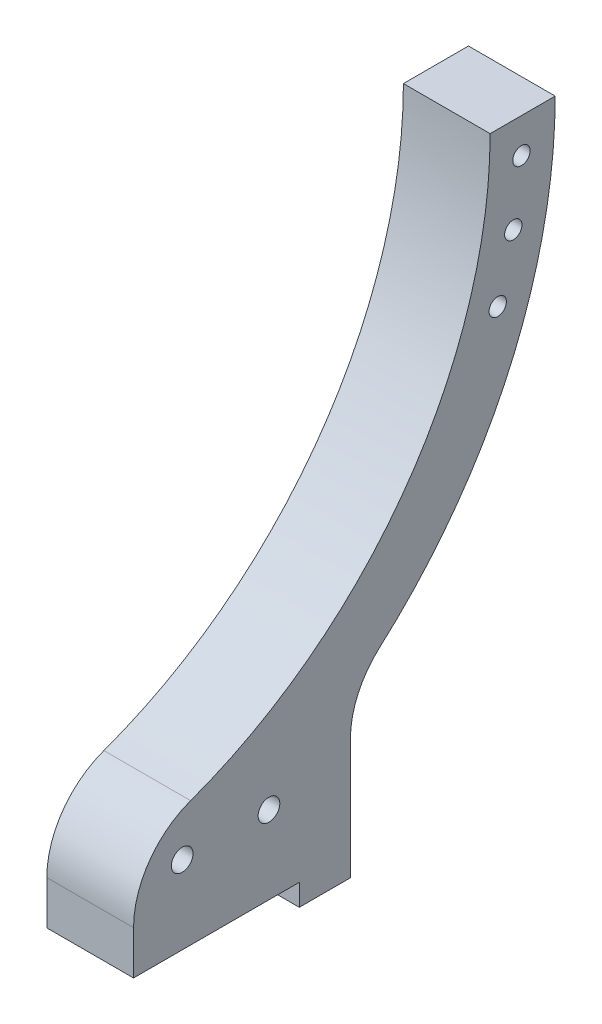
ISO-10303-21;
HEADER;
FILE_DESCRIPTION(('STEP AP214'),'2;1');
FILE_NAME('part.step','',(''),(''),'','','');
FILE_SCHEMA(('AUTOMOTIVE_DESIGN { 1 0 10303 214 1 1 1 1 }'));
ENDSEC;
DATA;
#1=APPLICATION_CONTEXT('core data for automotive mechanical design processes');
#2=APPLICATION_PROTOCOL_DEFINITION('international standard','automotive_design',2000,#1);
#3=PRODUCT_CONTEXT('',#1,'mechanical');
#4=PRODUCT('Part','Part','',(#3));
#5=PRODUCT_RELATED_PRODUCT_CATEGORY('part','',(#4));
#6=PRODUCT_DEFINITION_FORMATION('','',#4);
#7=PRODUCT_DEFINITION_CONTEXT('part definition',#1,'design');
#8=PRODUCT_DEFINITION('design','',#6,#7);
#9=PRODUCT_DEFINITION_SHAPE('','',#8);
#10=(LENGTH_UNIT() NAMED_UNIT(*) SI_UNIT(.MILLI.,.METRE.));
#11=(NAMED_UNIT(*) PLANE_ANGLE_UNIT() SI_UNIT($,.RADIAN.));
#12=(NAMED_UNIT(*) SI_UNIT($,.STERADIAN.) SOLID_ANGLE_UNIT());
#13=UNCERTAINTY_MEASURE_WITH_UNIT(LENGTH_MEASURE(1.E-05),#10,'distance_accuracy_value','');
#14=(GEOMETRIC_REPRESENTATION_CONTEXT(3) GLOBAL_UNCERTAINTY_ASSIGNED_CONTEXT((#13)) GLOBAL_UNIT_ASSIGNED_CONTEXT((#10,
#11,#12)) REPRESENTATION_CONTEXT('',''));
#15=CARTESIAN_POINT('',(0.,0.,0.));
#16=DIRECTION('',(0.,0.,1.));
#17=DIRECTION('',(1.,0.,0.));
#18=AXIS2_PLACEMENT_3D('',#15,#16,#17);
#19=CARTESIAN_POINT('',(0.,9.05,0.));
#20=DIRECTION('',(0.,1.,0.));
#21=DIRECTION('',(0.,0.,1.));
#22=AXIS2_PLACEMENT_3D('',#19,#20,#21);
#23=PLANE('',#22);
#24=DIRECTION('',(0.,0.,-1.));
#25=VECTOR('',#24,1.);
#26=CARTESIAN_POINT('',(-10.,9.05000000000002,-14.));
#27=LINE('',#26,#25);
#28=CARTESIAN_POINT('',(-10.,9.05000000000002,-119.));
#29=VERTEX_POINT('',#28);
#30=CARTESIAN_POINT('',(-10.,9.05000000000002,-134.));
#31=VERTEX_POINT('',#30);
#32=EDGE_CURVE('E127',#29,#31,#27,.T.);
#33=ORIENTED_EDGE('',*,*,#32,.F.);
#34=DIRECTION('',(1.,0.,0.));
#35=VECTOR('',#34,1.);
#36=CARTESIAN_POINT('',(-10.,9.05,-119.));
#37=LINE('',#36,#35);
#38=CARTESIAN_POINT('',(10.,9.05000000000002,-119.));
#39=VERTEX_POINT('',#38);
#40=EDGE_CURVE('E116',#39,#29,#37,.F.);
#41=ORIENTED_EDGE('',*,*,#40,.F.);
#42=DIRECTION('',(0.,0.,-1.));
#43=VECTOR('',#42,1.);
#44=CARTESIAN_POINT('',(10.,9.05000000000002,-14.));
#45=LINE('',#44,#43);
#46=CARTESIAN_POINT('',(10.,9.05000000000002,-134.));
#47=VERTEX_POINT('',#46);
#48=EDGE_CURVE('E39',#39,#47,#45,.T.);
#49=ORIENTED_EDGE('',*,*,#48,.T.);
#50=DIRECTION('',(1.,0.,0.));
#51=VECTOR('',#50,1.);
#52=CARTESIAN_POINT('',(-10.,9.05,-134.));
#53=LINE('',#52,#51);
#54=EDGE_CURVE('E128',#31,#47,#53,.T.);
#55=ORIENTED_EDGE('',*,*,#54,.F.);
#56=EDGE_LOOP('',(#33,#41,#49,#55));
#57=FACE_BOUND('',#56,.T.);
#58=ADVANCED_FACE('F36',(#57),#23,.T.);
#59=CARTESIAN_POINT('',(-10.,9.05000000000002,-14.));
#60=DIRECTION('',(1.,0.,0.));
#61=DIRECTION('',(0.,0.,-1.));
#62=AXIS2_PLACEMENT_3D('',#59,#60,#61);
#63=CYLINDRICAL_SURFACE('',#62,105.);
#64=CARTESIAN_POINT('',(10.,9.05000000000002,-14.));
#65=DIRECTION('',(-1.,0.,0.));
#66=DIRECTION('',(0.,0.,1.));
#67=AXIS2_PLACEMENT_3D('',#64,#65,#66);
#68=CIRCLE('',#67,105.);
#69=CARTESIAN_POINT('',(10.,-89.6105179727716,-49.931910516203));
#70=VERTEX_POINT('',#69);
#71=EDGE_CURVE('E52',#39,#70,#68,.T.);
#72=ORIENTED_EDGE('',*,*,#71,.F.);
#73=ORIENTED_EDGE('',*,*,#40,.T.);
#74=CARTESIAN_POINT('',(-10.,9.05000000000002,-14.));
#75=DIRECTION('',(-1.,0.,0.));
#76=DIRECTION('',(0.,0.,1.));
#77=AXIS2_PLACEMENT_3D('',#74,#75,#76);
#78=CIRCLE('',#77,105.);
#79=CARTESIAN_POINT('',(-10.,-89.6105179727716,-49.931910516203));
#80=VERTEX_POINT('',#79);
#81=EDGE_CURVE('E139',#29,#80,#78,.T.);
#82=ORIENTED_EDGE('',*,*,#81,.T.);
#83=DIRECTION('',(1.,0.,0.));
#84=VECTOR('',#83,1.);
#85=CARTESIAN_POINT('',(-10.,-89.6105179727716,-49.931910516203));
#86=LINE('',#85,#84);
#87=EDGE_CURVE('E119',#80,#70,#86,.T.);
#88=ORIENTED_EDGE('',*,*,#87,.T.);
#89=EDGE_LOOP('',(#72,#73,#82,#88));
#90=FACE_BOUND('',#89,.T.);
#91=ADVANCED_FACE('F115',(#90),#63,.F.);
#92=CARTESIAN_POINT('',(-10.,9.05000000000002,-14.));
#93=DIRECTION('',(1.,0.,0.));
#94=DIRECTION('',(0.,0.,-1.));
#95=AXIS2_PLACEMENT_3D('',#92,#93,#94);
#96=CYLINDRICAL_SURFACE('',#95,120.);
#97=CARTESIAN_POINT('',(-10.,9.05000000000002,-14.));
#98=DIRECTION('',(1.,0.,0.));
#99=DIRECTION('',(0.,0.,1.));
#100=AXIS2_PLACEMENT_3D('',#97,#98,#99);
#101=CIRCLE('',#100,120.);
#102=CARTESIAN_POINT('',(-10.,-80.8176506350812,-93.522357669595));
#103=VERTEX_POINT('',#102);
#104=EDGE_CURVE('E143',#103,#31,#101,.T.);
#105=ORIENTED_EDGE('',*,*,#104,.T.);
#106=ORIENTED_EDGE('',*,*,#54,.T.);
#107=CARTESIAN_POINT('',(10.,9.05000000000002,-14.));
#108=DIRECTION('',(1.,0.,0.));
#109=DIRECTION('',(0.,0.,1.));
#110=AXIS2_PLACEMENT_3D('',#107,#108,#109);
#111=CIRCLE('',#110,120.);
#112=CARTESIAN_POINT('',(10.,-80.8176506350812,-93.522357669595));
#113=VERTEX_POINT('',#112);
#114=EDGE_CURVE('E133',#113,#47,#111,.T.);
#115=ORIENTED_EDGE('',*,*,#114,.F.);
#116=DIRECTION('',(1.,0.,0.));
#117=VECTOR('',#116,1.);
#118=CARTESIAN_POINT('',(-10.,-80.8176506350812,-93.522357669595));
#119=LINE('',#118,#117);
#120=EDGE_CURVE('E145',#103,#113,#119,.T.);
#121=ORIENTED_EDGE('',*,*,#120,.F.);
#122=EDGE_LOOP('',(#105,#106,#115,#121));
#123=FACE_BOUND('',#122,.T.);
#124=ADVANCED_FACE('F141',(#123),#96,.T.);
#125=CARTESIAN_POINT('',(-10.,9.05000000000002,-14.));
#126=DIRECTION('',(-1.,0.,0.));
#127=DIRECTION('',(0.,0.,1.));
#128=AXIS2_PLACEMENT_3D('',#125,#126,#127);
#129=PLANE('',#128);
#130=CARTESIAN_POINT('',(-9.99999999999999,-100.45,-68.));
#131=DIRECTION('',(-1.,0.,0.));
#132=DIRECTION('',(0.,0.,1.));
#133=AXIS2_PLACEMENT_3D('',#130,#131,#132);
#134=CIRCLE('',#133,2.50000000000001);
#135=CARTESIAN_POINT('',(-9.99999999999999,-100.45,-65.5));
#136=VERTEX_POINT('',#135);
#137=EDGE_CURVE('E162',#136,#136,#134,.T.);
#138=ORIENTED_EDGE('',*,*,#137,.F.);
#139=EDGE_LOOP('',(#138));
#140=FACE_BOUND('',#139,.T.);
#141=CARTESIAN_POINT('',(-9.99999999999999,-100.45,-48.));
#142=DIRECTION('',(-1.,0.,0.));
#143=DIRECTION('',(0.,0.,1.));
#144=AXIS2_PLACEMENT_3D('',#141,#142,#143);
#145=CIRCLE('',#144,2.5);
#146=CARTESIAN_POINT('',(-9.99999999999999,-100.45,-45.5));
#147=VERTEX_POINT('',#146);
#148=EDGE_CURVE('E120',#147,#147,#145,.T.);
#149=ORIENTED_EDGE('',*,*,#148,.F.);
#150=EDGE_LOOP('',(#149));
#151=FACE_BOUND('',#150,.T.);
#152=CARTESIAN_POINT('',(-9.99999999999999,-26.3564359955439,-120.752866634464));
#153=DIRECTION('',(-1.,0.,0.));
#154=DIRECTION('',(0.,0.,1.));
#155=AXIS2_PLACEMENT_3D('',#152,#153,#154);
#156=CIRCLE('',#155,2.);
#157=CARTESIAN_POINT('',(-9.99999999999998,-26.3564359955439,-122.752866634464));
#158=VERTEX_POINT('',#157);
#159=EDGE_CURVE('E44',#158,#158,#156,.T.);
#160=ORIENTED_EDGE('',*,*,#159,.F.);
#161=EDGE_LOOP('',(#160));
#162=FACE_BOUND('',#161,.T.);
#163=CARTESIAN_POINT('',(-9.99999999999999,-12.824300323222,-124.341920011871));
#164=DIRECTION('',(-1.,0.,0.));
#165=DIRECTION('',(0.,0.,1.));
#166=AXIS2_PLACEMENT_3D('',#163,#164,#165);
#167=CIRCLE('',#166,2.);
#168=CARTESIAN_POINT('',(-9.99999999999998,-12.824300323222,-126.341920011871));
#169=VERTEX_POINT('',#168);
#170=EDGE_CURVE('E154',#169,#169,#167,.T.);
#171=ORIENTED_EDGE('',*,*,#170,.F.);
#172=EDGE_LOOP('',(#171));
#173=FACE_BOUND('',#172,.T.);
#174=CARTESIAN_POINT('',(-9.99999999999999,1.05000000000006,-126.213761495822));
#175=DIRECTION('',(-1.,0.,0.));
#176=DIRECTION('',(0.,0.,1.));
#177=AXIS2_PLACEMENT_3D('',#174,#175,#176);
#178=CIRCLE('',#177,2.);
#179=CARTESIAN_POINT('',(-9.99999999999998,1.05000000000006,-128.213761495822));
#180=VERTEX_POINT('',#179);
#181=EDGE_CURVE('E158',#180,#180,#178,.T.);
#182=ORIENTED_EDGE('',*,*,#181,.F.);
#183=EDGE_LOOP('',(#182));
#184=FACE_BOUND('',#183,.T.);
#185=ORIENTED_EDGE('',*,*,#81,.F.);
#186=ORIENTED_EDGE('',*,*,#32,.T.);
#187=ORIENTED_EDGE('',*,*,#104,.F.);
#188=CARTESIAN_POINT('',(-10.,-95.7955924075947,-106.776083947861));
#189=DIRECTION('',(-1.,0.,0.));
#190=DIRECTION('',(0.,0.,-1.));
#191=AXIS2_PLACEMENT_3D('',#188,#189,#190);
#192=CIRCLE('',#191,20.);
#193=CARTESIAN_POINT('',(-10.,-95.7955924075947,-86.7760839478608));
#194=VERTEX_POINT('',#193);
#195=EDGE_CURVE('E150',#194,#103,#192,.T.);
#196=ORIENTED_EDGE('',*,*,#195,.F.);
#197=DIRECTION('',(0.,1.,0.));
#198=VECTOR('',#197,1.);
#199=CARTESIAN_POINT('',(-10.,-95.7955924075947,-86.7760839478608));
#200=LINE('',#199,#198);
#201=CARTESIAN_POINT('',(-10.,-123.45,-86.7760839478608));
#202=VERTEX_POINT('',#201);
#203=EDGE_CURVE('E197',#202,#194,#200,.T.);
#204=ORIENTED_EDGE('',*,*,#203,.F.);
#205=DIRECTION('',(0.,0.,-1.));
#206=VECTOR('',#205,1.);
#207=CARTESIAN_POINT('',(-10.,-123.45,-86.7760839478608));
#208=LINE('',#207,#206);
#209=CARTESIAN_POINT('',(-10.,-123.45,-75.));
#210=VERTEX_POINT('',#209);
#211=EDGE_CURVE('E194',#210,#202,#208,.T.);
#212=ORIENTED_EDGE('',*,*,#211,.F.);
#213=DIRECTION('',(0.,-1.,0.));
#214=VECTOR('',#213,1.);
#215=CARTESIAN_POINT('',(-10.,-118.45,-75.));
#216=LINE('',#215,#214);
#217=CARTESIAN_POINT('',(-10.,-118.45,-75.));
#218=VERTEX_POINT('',#217);
#219=EDGE_CURVE('E191',#218,#210,#216,.T.);
#220=ORIENTED_EDGE('',*,*,#219,.F.);
#221=DIRECTION('',(0.,0.,-1.));
#222=VECTOR('',#221,1.);
#223=CARTESIAN_POINT('',(-10.,-118.45,-36.7760839478608));
#224=LINE('',#223,#222);
#225=CARTESIAN_POINT('',(-10.,-118.45,-36.7760839478608));
#226=VERTEX_POINT('',#225);
#227=EDGE_CURVE('E188',#226,#218,#224,.T.);
#228=ORIENTED_EDGE('',*,*,#227,.F.);
#229=DIRECTION('',(0.,-1.,0.));
#230=VECTOR('',#229,1.);
#231=CARTESIAN_POINT('',(-10.,-108.402997586633,-36.7760839478608));
#232=LINE('',#231,#230);
#233=CARTESIAN_POINT('',(-10.,-108.402997586633,-36.7760839478608));
#234=VERTEX_POINT('',#233);
#235=EDGE_CURVE('E185',#234,#226,#232,.T.);
#236=ORIENTED_EDGE('',*,*,#235,.F.);
#237=CARTESIAN_POINT('',(-10.,-108.402997586633,-56.7760839478608));
#238=DIRECTION('',(1.,0.,0.));
#239=DIRECTION('',(0.,0.,-1.));
#240=AXIS2_PLACEMENT_3D('',#237,#238,#239);
#241=CIRCLE('',#240,20.);
#242=EDGE_CURVE('E148',#80,#234,#241,.T.);
#243=ORIENTED_EDGE('',*,*,#242,.F.);
#244=EDGE_LOOP('',(#185,#186,#187,#196,#204,#212,#220,#228,#236,#243));
#245=FACE_BOUND('',#244,.T.);
#246=ADVANCED_FACE('F243',(#140,#151,#162,#173,#184,#245),#129,.T.);
#247=CARTESIAN_POINT('',(10.,9.05000000000002,-14.));
#248=DIRECTION('',(-1.,0.,0.));
#249=DIRECTION('',(0.,0.,1.));
#250=AXIS2_PLACEMENT_3D('',#247,#248,#249);
#251=PLANE('',#250);
#252=CARTESIAN_POINT('',(9.99999999999999,-100.45,-68.));
#253=DIRECTION('',(-1.,0.,0.));
#254=DIRECTION('',(0.,0.,1.));
#255=AXIS2_PLACEMENT_3D('',#252,#253,#254);
#256=CIRCLE('',#255,2.50000000000001);
#257=CARTESIAN_POINT('',(9.99999999999999,-100.45,-65.5));
#258=VERTEX_POINT('',#257);
#259=EDGE_CURVE('E161',#258,#258,#256,.T.);
#260=ORIENTED_EDGE('',*,*,#259,.T.);
#261=EDGE_LOOP('',(#260));
#262=FACE_BOUND('',#261,.T.);
#263=CARTESIAN_POINT('',(9.99999999999999,-100.45,-48.));
#264=DIRECTION('',(-1.,0.,0.));
#265=DIRECTION('',(0.,0.,1.));
#266=AXIS2_PLACEMENT_3D('',#263,#264,#265);
#267=CIRCLE('',#266,2.5);
#268=CARTESIAN_POINT('',(9.99999999999999,-100.45,-45.5));
#269=VERTEX_POINT('',#268);
#270=EDGE_CURVE('E165',#269,#269,#267,.T.);
#271=ORIENTED_EDGE('',*,*,#270,.T.);
#272=EDGE_LOOP('',(#271));
#273=FACE_BOUND('',#272,.T.);
#274=CARTESIAN_POINT('',(9.99999999999999,-26.3564359955439,-120.752866634464));
#275=DIRECTION('',(-1.,0.,0.));
#276=DIRECTION('',(0.,0.,1.));
#277=AXIS2_PLACEMENT_3D('',#274,#275,#276);
#278=CIRCLE('',#277,2.);
#279=CARTESIAN_POINT('',(10.,-26.3564359955439,-122.752866634464));
#280=VERTEX_POINT('',#279);
#281=EDGE_CURVE('E11',#280,#280,#278,.T.);
#282=ORIENTED_EDGE('',*,*,#281,.T.);
#283=EDGE_LOOP('',(#282));
#284=FACE_BOUND('',#283,.T.);
#285=CARTESIAN_POINT('',(9.99999999999999,-12.824300323222,-124.341920011871));
#286=DIRECTION('',(-1.,0.,0.));
#287=DIRECTION('',(0.,0.,1.));
#288=AXIS2_PLACEMENT_3D('',#285,#286,#287);
#289=CIRCLE('',#288,2.);
#290=CARTESIAN_POINT('',(10.,-12.824300323222,-126.341920011871));
#291=VERTEX_POINT('',#290);
#292=EDGE_CURVE('E153',#291,#291,#289,.T.);
#293=ORIENTED_EDGE('',*,*,#292,.T.);
#294=EDGE_LOOP('',(#293));
#295=FACE_BOUND('',#294,.T.);
#296=CARTESIAN_POINT('',(9.99999999999999,1.05000000000006,-126.213761495822));
#297=DIRECTION('',(-1.,0.,0.));
#298=DIRECTION('',(0.,0.,1.));
#299=AXIS2_PLACEMENT_3D('',#296,#297,#298);
#300=CIRCLE('',#299,2.);
#301=CARTESIAN_POINT('',(10.,1.05000000000006,-128.213761495822));
#302=VERTEX_POINT('',#301);
#303=EDGE_CURVE('E157',#302,#302,#300,.T.);
#304=ORIENTED_EDGE('',*,*,#303,.T.);
#305=EDGE_LOOP('',(#304));
#306=FACE_BOUND('',#305,.T.);
#307=ORIENTED_EDGE('',*,*,#48,.F.);
#308=ORIENTED_EDGE('',*,*,#71,.T.);
#309=CARTESIAN_POINT('',(10.,-108.402997586633,-56.7760839478608));
#310=DIRECTION('',(1.,0.,0.));
#311=DIRECTION('',(0.,0.,-1.));
#312=AXIS2_PLACEMENT_3D('',#309,#310,#311);
#313=CIRCLE('',#312,20.);
#314=CARTESIAN_POINT('',(10.,-108.402997586633,-36.7760839478608));
#315=VERTEX_POINT('',#314);
#316=EDGE_CURVE('E121',#70,#315,#313,.T.);
#317=ORIENTED_EDGE('',*,*,#316,.T.);
#318=DIRECTION('',(0.,-1.,0.));
#319=VECTOR('',#318,1.);
#320=CARTESIAN_POINT('',(10.,-108.402997586633,-36.7760839478608));
#321=LINE('',#320,#319);
#322=CARTESIAN_POINT('',(10.,-118.45,-36.7760839478608));
#323=VERTEX_POINT('',#322);
#324=EDGE_CURVE('E169',#315,#323,#321,.T.);
#325=ORIENTED_EDGE('',*,*,#324,.T.);
#326=DIRECTION('',(0.,0.,-1.));
#327=VECTOR('',#326,1.);
#328=CARTESIAN_POINT('',(10.,-118.45,-36.7760839478608));
#329=LINE('',#328,#327);
#330=CARTESIAN_POINT('',(10.,-118.45,-75.));
#331=VERTEX_POINT('',#330);
#332=EDGE_CURVE('E172',#323,#331,#329,.T.);
#333=ORIENTED_EDGE('',*,*,#332,.T.);
#334=DIRECTION('',(0.,-1.,0.));
#335=VECTOR('',#334,1.);
#336=CARTESIAN_POINT('',(10.,-118.45,-75.));
#337=LINE('',#336,#335);
#338=CARTESIAN_POINT('',(10.,-123.45,-75.));
#339=VERTEX_POINT('',#338);
#340=EDGE_CURVE('E175',#331,#339,#337,.T.);
#341=ORIENTED_EDGE('',*,*,#340,.T.);
#342=DIRECTION('',(0.,0.,-1.));
#343=VECTOR('',#342,1.);
#344=CARTESIAN_POINT('',(10.,-123.45,-86.7760839478608));
#345=LINE('',#344,#343);
#346=CARTESIAN_POINT('',(10.,-123.45,-86.7760839478608));
#347=VERTEX_POINT('',#346);
#348=EDGE_CURVE('E178',#339,#347,#345,.T.);
#349=ORIENTED_EDGE('',*,*,#348,.T.);
#350=DIRECTION('',(0.,1.,0.));
#351=VECTOR('',#350,1.);
#352=CARTESIAN_POINT('',(10.,-95.7955924075947,-86.7760839478608));
#353=LINE('',#352,#351);
#354=CARTESIAN_POINT('',(10.,-95.7955924075947,-86.7760839478608));
#355=VERTEX_POINT('',#354);
#356=EDGE_CURVE('E181',#347,#355,#353,.T.);
#357=ORIENTED_EDGE('',*,*,#356,.T.);
#358=CARTESIAN_POINT('',(10.,-95.7955924075947,-106.776083947861));
#359=DIRECTION('',(-1.,0.,0.));
#360=DIRECTION('',(0.,0.,-1.));
#361=AXIS2_PLACEMENT_3D('',#358,#359,#360);
#362=CIRCLE('',#361,20.);
#363=EDGE_CURVE('E137',#355,#113,#362,.T.);
#364=ORIENTED_EDGE('',*,*,#363,.T.);
#365=ORIENTED_EDGE('',*,*,#114,.T.);
#366=EDGE_LOOP('',(#307,#308,#317,#325,#333,#341,#349,#357,#364,#365));
#367=FACE_BOUND('',#366,.T.);
#368=ADVANCED_FACE('F130',(#262,#273,#284,#295,#306,#367),#251,.F.);
#369=CARTESIAN_POINT('',(-10.,-95.7955924075947,-106.776083947861));
#370=DIRECTION('',(1.,0.,0.));
#371=DIRECTION('',(0.,0.,-1.));
#372=AXIS2_PLACEMENT_3D('',#369,#370,#371);
#373=CYLINDRICAL_SURFACE('',#372,20.);
#374=ORIENTED_EDGE('',*,*,#120,.T.);
#375=ORIENTED_EDGE('',*,*,#363,.F.);
#376=DIRECTION('',(1.,0.,0.));
#377=VECTOR('',#376,1.);
#378=CARTESIAN_POINT('',(-10.,-95.7955924075947,-86.7760839478608));
#379=LINE('',#378,#377);
#380=EDGE_CURVE('E203',#194,#355,#379,.T.);
#381=ORIENTED_EDGE('',*,*,#380,.F.);
#382=ORIENTED_EDGE('',*,*,#195,.T.);
#383=EDGE_LOOP('',(#374,#375,#381,#382));
#384=FACE_BOUND('',#383,.T.);
#385=ADVANCED_FACE('F246',(#384),#373,.F.);
#386=CARTESIAN_POINT('',(-10.,-95.7955924075947,-86.7760839478608));
#387=DIRECTION('',(0.,0.,-1.));
#388=DIRECTION('',(-1.,0.,0.));
#389=AXIS2_PLACEMENT_3D('',#386,#387,#388);
#390=PLANE('',#389);
#391=ORIENTED_EDGE('',*,*,#380,.T.);
#392=ORIENTED_EDGE('',*,*,#356,.F.);
#393=DIRECTION('',(1.,0.,0.));
#394=VECTOR('',#393,1.);
#395=CARTESIAN_POINT('',(-10.,-123.45,-86.7760839478608));
#396=LINE('',#395,#394);
#397=EDGE_CURVE('E205',#202,#347,#396,.T.);
#398=ORIENTED_EDGE('',*,*,#397,.F.);
#399=ORIENTED_EDGE('',*,*,#203,.T.);
#400=EDGE_LOOP('',(#391,#392,#398,#399));
#401=FACE_BOUND('',#400,.T.);
#402=ADVANCED_FACE('F283',(#401),#390,.T.);
#403=CARTESIAN_POINT('',(-10.,-123.45,-86.7760839478608));
#404=DIRECTION('',(0.,-1.,0.));
#405=DIRECTION('',(0.,0.,-1.));
#406=AXIS2_PLACEMENT_3D('',#403,#404,#405);
#407=PLANE('',#406);
#408=ORIENTED_EDGE('',*,*,#397,.T.);
#409=ORIENTED_EDGE('',*,*,#348,.F.);
#410=DIRECTION('',(1.,0.,0.));
#411=VECTOR('',#410,1.);
#412=CARTESIAN_POINT('',(-10.,-123.45,-75.));
#413=LINE('',#412,#411);
#414=EDGE_CURVE('E207',#210,#339,#413,.T.);
#415=ORIENTED_EDGE('',*,*,#414,.F.);
#416=ORIENTED_EDGE('',*,*,#211,.T.);
#417=EDGE_LOOP('',(#408,#409,#415,#416));
#418=FACE_BOUND('',#417,.T.);
#419=ADVANCED_FACE('F281',(#418),#407,.T.);
#420=CARTESIAN_POINT('',(-10.,-118.45,-75.));
#421=DIRECTION('',(0.,0.,1.));
#422=DIRECTION('',(1.,0.,0.));
#423=AXIS2_PLACEMENT_3D('',#420,#421,#422);
#424=PLANE('',#423);
#425=ORIENTED_EDGE('',*,*,#414,.T.);
#426=ORIENTED_EDGE('',*,*,#340,.F.);
#427=DIRECTION('',(1.,0.,0.));
#428=VECTOR('',#427,1.);
#429=CARTESIAN_POINT('',(-10.,-118.45,-75.));
#430=LINE('',#429,#428);
#431=EDGE_CURVE('E209',#218,#331,#430,.T.);
#432=ORIENTED_EDGE('',*,*,#431,.F.);
#433=ORIENTED_EDGE('',*,*,#219,.T.);
#434=EDGE_LOOP('',(#425,#426,#432,#433));
#435=FACE_BOUND('',#434,.T.);
#436=ADVANCED_FACE('F276',(#435),#424,.T.);
#437=CARTESIAN_POINT('',(-10.,-118.45,-36.7760839478608));
#438=DIRECTION('',(0.,-1.,0.));
#439=DIRECTION('',(0.,0.,-1.));
#440=AXIS2_PLACEMENT_3D('',#437,#438,#439);
#441=PLANE('',#440);
#442=ORIENTED_EDGE('',*,*,#431,.T.);
#443=ORIENTED_EDGE('',*,*,#332,.F.);
#444=DIRECTION('',(1.,0.,0.));
#445=VECTOR('',#444,1.);
#446=CARTESIAN_POINT('',(-10.,-118.45,-36.7760839478608));
#447=LINE('',#446,#445);
#448=EDGE_CURVE('E211',#226,#323,#447,.T.);
#449=ORIENTED_EDGE('',*,*,#448,.F.);
#450=ORIENTED_EDGE('',*,*,#227,.T.);
#451=EDGE_LOOP('',(#442,#443,#449,#450));
#452=FACE_BOUND('',#451,.T.);
#453=ADVANCED_FACE('F271',(#452),#441,.T.);
#454=CARTESIAN_POINT('',(-10.,-108.402997586633,-36.7760839478608));
#455=DIRECTION('',(0.,0.,1.));
#456=DIRECTION('',(1.,0.,0.));
#457=AXIS2_PLACEMENT_3D('',#454,#455,#456);
#458=PLANE('',#457);
#459=ORIENTED_EDGE('',*,*,#448,.T.);
#460=ORIENTED_EDGE('',*,*,#324,.F.);
#461=DIRECTION('',(1.,0.,0.));
#462=VECTOR('',#461,1.);
#463=CARTESIAN_POINT('',(-10.,-108.402997586633,-36.7760839478608));
#464=LINE('',#463,#462);
#465=EDGE_CURVE('E60',#234,#315,#464,.T.);
#466=ORIENTED_EDGE('',*,*,#465,.F.);
#467=ORIENTED_EDGE('',*,*,#235,.T.);
#468=EDGE_LOOP('',(#459,#460,#466,#467));
#469=FACE_BOUND('',#468,.T.);
#470=ADVANCED_FACE('F268',(#469),#458,.T.);
#471=CARTESIAN_POINT('',(-10.,-108.402997586633,-56.7760839478608));
#472=DIRECTION('',(1.,0.,0.));
#473=DIRECTION('',(0.,0.,-1.));
#474=AXIS2_PLACEMENT_3D('',#471,#472,#473);
#475=CYLINDRICAL_SURFACE('',#474,20.);
#476=ORIENTED_EDGE('',*,*,#465,.T.);
#477=ORIENTED_EDGE('',*,*,#316,.F.);
#478=ORIENTED_EDGE('',*,*,#87,.F.);
#479=ORIENTED_EDGE('',*,*,#242,.T.);
#480=EDGE_LOOP('',(#476,#477,#478,#479));
#481=FACE_BOUND('',#480,.T.);
#482=ADVANCED_FACE('F264',(#481),#475,.T.);
#483=CARTESIAN_POINT('',(-99.5,-100.45,-68.));
#484=DIRECTION('',(1.,0.,0.));
#485=DIRECTION('',(0.,0.,-1.));
#486=AXIS2_PLACEMENT_3D('',#483,#484,#485);
#487=CYLINDRICAL_SURFACE('',#486,2.50000000000001);
#488=ORIENTED_EDGE('',*,*,#137,.T.);
#489=EDGE_LOOP('',(#488));
#490=FACE_BOUND('',#489,.T.);
#491=ORIENTED_EDGE('',*,*,#259,.F.);
#492=EDGE_LOOP('',(#491));
#493=FACE_BOUND('',#492,.T.);
#494=ADVANCED_FACE('F294',(#490,#493),#487,.F.);
#495=CARTESIAN_POINT('',(-99.5,-100.45,-48.));
#496=DIRECTION('',(1.,0.,0.));
#497=DIRECTION('',(0.,0.,-1.));
#498=AXIS2_PLACEMENT_3D('',#495,#496,#497);
#499=CYLINDRICAL_SURFACE('',#498,2.5);
#500=ORIENTED_EDGE('',*,*,#148,.T.);
#501=EDGE_LOOP('',(#500));
#502=FACE_BOUND('',#501,.T.);
#503=ORIENTED_EDGE('',*,*,#270,.F.);
#504=EDGE_LOOP('',(#503));
#505=FACE_BOUND('',#504,.T.);
#506=ADVANCED_FACE('F297',(#502,#505),#499,.F.);
#507=CARTESIAN_POINT('',(-99.5,-26.3564359955439,-120.752866634464));
#508=DIRECTION('',(1.,0.,0.));
#509=DIRECTION('',(0.,0.,-1.));
#510=AXIS2_PLACEMENT_3D('',#507,#508,#509);
#511=CYLINDRICAL_SURFACE('',#510,2.);
#512=CARTESIAN_POINT('',(-9.99999999999998,-26.3564359955439,-122.752866634464));
#513=CARTESIAN_POINT('',(-9.79166666666665,-26.3564359955439,-122.752866634464));
#514=CARTESIAN_POINT('',(-9.58333333333331,-26.3564359955439,-122.752866634464));
#515=CARTESIAN_POINT('',(-9.16666666666665,-26.3564359955439,-122.752866634464));
#516=CARTESIAN_POINT('',(-8.95833333333331,-26.3564359955439,-122.752866634464));
#517=CARTESIAN_POINT('',(-8.54166666666665,-26.3564359955439,-122.752866634464));
#518=CARTESIAN_POINT('',(-8.33333333333331,-26.3564359955439,-122.752866634464));
#519=CARTESIAN_POINT('',(-7.91666666666665,-26.3564359955439,-122.752866634464));
#520=CARTESIAN_POINT('',(-7.70833333333331,-26.3564359955439,-122.752866634464));
#521=CARTESIAN_POINT('',(-7.29166666666664,-26.3564359955439,-122.752866634464));
#522=CARTESIAN_POINT('',(-7.08333333333331,-26.3564359955439,-122.752866634464));
#523=CARTESIAN_POINT('',(-6.66666666666664,-26.3564359955439,-122.752866634464));
#524=CARTESIAN_POINT('',(-6.45833333333331,-26.3564359955439,-122.752866634464));
#525=CARTESIAN_POINT('',(-6.04166666666664,-26.3564359955439,-122.752866634464));
#526=CARTESIAN_POINT('',(-5.83333333333331,-26.3564359955439,-122.752866634464));
#527=CARTESIAN_POINT('',(-5.41666666666664,-26.3564359955439,-122.752866634464));
#528=CARTESIAN_POINT('',(-5.20833333333331,-26.3564359955439,-122.752866634464));
#529=CARTESIAN_POINT('',(-4.79166666666665,-26.3564359955439,-122.752866634464));
#530=CARTESIAN_POINT('',(-4.58333333333332,-26.3564359955439,-122.752866634464));
#531=CARTESIAN_POINT('',(-4.16666666666666,-26.3564359955439,-122.752866634464));
#532=CARTESIAN_POINT('',(-3.95833333333332,-26.3564359955439,-122.752866634464));
#533=CARTESIAN_POINT('',(-3.54166666666666,-26.3564359955439,-122.752866634464));
#534=CARTESIAN_POINT('',(-3.33333333333332,-26.3564359955439,-122.752866634464));
#535=CARTESIAN_POINT('',(-2.91666666666666,-26.3564359955439,-122.752866634464));
#536=CARTESIAN_POINT('',(-2.70833333333332,-26.3564359955439,-122.752866634464));
#537=CARTESIAN_POINT('',(-2.29166666666665,-26.3564359955439,-122.752866634464));
#538=CARTESIAN_POINT('',(-2.08333333333332,-26.3564359955439,-122.752866634464));
#539=CARTESIAN_POINT('',(-1.66666666666665,-26.3564359955439,-122.752866634464));
#540=CARTESIAN_POINT('',(-1.45833333333332,-26.3564359955439,-122.752866634464));
#541=CARTESIAN_POINT('',(-1.04166666666665,-26.3564359955439,-122.752866634464));
#542=CARTESIAN_POINT('',(-0.83333333333332,-26.3564359955439,-122.752866634464));
#543=CARTESIAN_POINT('',(-0.416666666666653,-26.3564359955439,-122.752866634464));
#544=CARTESIAN_POINT('',(-0.20833333333332,-26.3564359955439,-122.752866634464));
#545=CARTESIAN_POINT('',(0.208333333333347,-26.3564359955439,-122.752866634464));
#546=CARTESIAN_POINT('',(0.416666666666681,-26.3564359955439,-122.752866634464));
#547=CARTESIAN_POINT('',(0.833333333333348,-26.3564359955439,-122.752866634464));
#548=CARTESIAN_POINT('',(1.04166666666668,-26.3564359955439,-122.752866634464));
#549=CARTESIAN_POINT('',(1.45833333333335,-26.3564359955439,-122.752866634464));
#550=CARTESIAN_POINT('',(1.66666666666668,-26.3564359955439,-122.752866634464));
#551=CARTESIAN_POINT('',(2.08333333333335,-26.3564359955439,-122.752866634464));
#552=CARTESIAN_POINT('',(2.29166666666668,-26.3564359955439,-122.752866634464));
#553=CARTESIAN_POINT('',(2.70833333333335,-26.3564359955439,-122.752866634464));
#554=CARTESIAN_POINT('',(2.91666666666668,-26.3564359955439,-122.752866634464));
#555=CARTESIAN_POINT('',(3.33333333333335,-26.3564359955439,-122.752866634464));
#556=CARTESIAN_POINT('',(3.54166666666668,-26.3564359955439,-122.752866634464));
#557=CARTESIAN_POINT('',(3.95833333333335,-26.3564359955439,-122.752866634464));
#558=CARTESIAN_POINT('',(4.16666666666668,-26.3564359955439,-122.752866634464));
#559=CARTESIAN_POINT('',(4.58333333333335,-26.3564359955439,-122.752866634464));
#560=CARTESIAN_POINT('',(4.79166666666668,-26.3564359955439,-122.752866634464));
#561=CARTESIAN_POINT('',(5.20833333333334,-26.3564359955439,-122.752866634464));
#562=CARTESIAN_POINT('',(5.41666666666668,-26.3564359955439,-122.752866634464));
#563=CARTESIAN_POINT('',(5.83333333333335,-26.3564359955439,-122.752866634464));
#564=CARTESIAN_POINT('',(6.04166666666668,-26.3564359955439,-122.752866634464));
#565=CARTESIAN_POINT('',(6.45833333333334,-26.3564359955439,-122.752866634464));
#566=CARTESIAN_POINT('',(6.66666666666667,-26.3564359955439,-122.752866634464));
#567=CARTESIAN_POINT('',(7.08333333333334,-26.3564359955439,-122.752866634464));
#568=CARTESIAN_POINT('',(7.29166666666667,-26.3564359955439,-122.752866634464));
#569=CARTESIAN_POINT('',(7.70833333333334,-26.3564359955439,-122.752866634464));
#570=CARTESIAN_POINT('',(7.91666666666667,-26.3564359955439,-122.752866634464));
#571=CARTESIAN_POINT('',(8.33333333333334,-26.3564359955439,-122.752866634464));
#572=CARTESIAN_POINT('',(8.54166666666667,-26.3564359955439,-122.752866634464));
#573=CARTESIAN_POINT('',(8.95833333333334,-26.3564359955439,-122.752866634464));
#574=CARTESIAN_POINT('',(9.16666666666667,-26.3564359955439,-122.752866634464));
#575=CARTESIAN_POINT('',(9.58333333333334,-26.3564359955439,-122.752866634464));
#576=CARTESIAN_POINT('',(9.79166666666668,-26.3564359955439,-122.752866634464));
#577=CARTESIAN_POINT('',(10.,-26.3564359955439,-122.752866634464));
#578=B_SPLINE_CURVE_WITH_KNOTS('',3,(#512,#513,#514,#515,#516,#517,#518,#519,#520,#521,#522,
#523,#524,#525,#526,#527,#528,#529,#530,#531,#532,#533,#534,#535,#536,#537,#538,#539,#540,#541,
#542,#543,#544,#545,#546,#547,#548,#549,#550,#551,#552,#553,#554,#555,#556,#557,#558,#559,#560,
#561,#562,#563,#564,#565,#566,#567,#568,#569,#570,#571,#572,#573,#574,#575,#576,#577),
.UNSPECIFIED.,.F.,.F.,(4,2,2,2,2,2,2,2,2,2,2,2,2,2,2,2,2,2,2,2,2,2,2,2,2,2,2,2,2,2,2,2,4),(0.,
0.625000000000001,1.25,1.875,2.5,3.125,3.75,4.375,5.,5.62499999999999,6.24999999999999,
6.87499999999999,7.49999999999999,8.12499999999999,8.74999999999999,9.37499999999999,
9.99999999999999,10.625,11.25,11.875,12.5,13.125,13.75,14.375,15.,15.625,16.25,16.875,17.5,
18.125,18.75,19.375,20.),.UNSPECIFIED.);
#579=EDGE_CURVE('BSEAM233',#158,#280,#578,.T.);
#580=ORIENTED_EDGE('',*,*,#159,.T.);
#581=ORIENTED_EDGE('',*,*,#281,.F.);
#582=ORIENTED_EDGE('',*,*,#579,.T.);
#583=ORIENTED_EDGE('',*,*,#579,.F.);
#584=EDGE_LOOP('',(#580,#582,#581,#583));
#585=FACE_BOUND('',#584,.T.);
#586=ADVANCED_FACE('F233',(#585),#511,.F.);
#587=CARTESIAN_POINT('',(-99.5,-12.824300323222,-124.341920011871));
#588=DIRECTION('',(1.,0.,0.));
#589=DIRECTION('',(0.,0.,-1.));
#590=AXIS2_PLACEMENT_3D('',#587,#588,#589);
#591=CYLINDRICAL_SURFACE('',#590,2.);
#592=CARTESIAN_POINT('',(-9.99999999999998,-12.824300323222,-126.341920011871));
#593=CARTESIAN_POINT('',(-9.79166666666665,-12.824300323222,-126.341920011871));
#594=CARTESIAN_POINT('',(-9.58333333333331,-12.824300323222,-126.341920011871));
#595=CARTESIAN_POINT('',(-9.16666666666665,-12.824300323222,-126.341920011871));
#596=CARTESIAN_POINT('',(-8.95833333333331,-12.824300323222,-126.341920011871));
#597=CARTESIAN_POINT('',(-8.54166666666665,-12.824300323222,-126.341920011871));
#598=CARTESIAN_POINT('',(-8.33333333333331,-12.824300323222,-126.341920011871));
#599=CARTESIAN_POINT('',(-7.91666666666665,-12.824300323222,-126.341920011871));
#600=CARTESIAN_POINT('',(-7.70833333333331,-12.824300323222,-126.341920011871));
#601=CARTESIAN_POINT('',(-7.29166666666664,-12.824300323222,-126.341920011871));
#602=CARTESIAN_POINT('',(-7.08333333333331,-12.824300323222,-126.341920011871));
#603=CARTESIAN_POINT('',(-6.66666666666664,-12.824300323222,-126.341920011871));
#604=CARTESIAN_POINT('',(-6.45833333333331,-12.824300323222,-126.341920011871));
#605=CARTESIAN_POINT('',(-6.04166666666664,-12.824300323222,-126.341920011871));
#606=CARTESIAN_POINT('',(-5.83333333333331,-12.824300323222,-126.341920011871));
#607=CARTESIAN_POINT('',(-5.41666666666664,-12.824300323222,-126.341920011871));
#608=CARTESIAN_POINT('',(-5.20833333333331,-12.824300323222,-126.341920011871));
#609=CARTESIAN_POINT('',(-4.79166666666665,-12.824300323222,-126.341920011871));
#610=CARTESIAN_POINT('',(-4.58333333333332,-12.824300323222,-126.341920011871));
#611=CARTESIAN_POINT('',(-4.16666666666666,-12.824300323222,-126.341920011871));
#612=CARTESIAN_POINT('',(-3.95833333333332,-12.824300323222,-126.341920011871));
#613=CARTESIAN_POINT('',(-3.54166666666666,-12.824300323222,-126.341920011871));
#614=CARTESIAN_POINT('',(-3.33333333333332,-12.824300323222,-126.341920011871));
#615=CARTESIAN_POINT('',(-2.91666666666666,-12.824300323222,-126.341920011871));
#616=CARTESIAN_POINT('',(-2.70833333333332,-12.824300323222,-126.341920011871));
#617=CARTESIAN_POINT('',(-2.29166666666665,-12.824300323222,-126.341920011871));
#618=CARTESIAN_POINT('',(-2.08333333333332,-12.824300323222,-126.341920011871));
#619=CARTESIAN_POINT('',(-1.66666666666665,-12.824300323222,-126.341920011871));
#620=CARTESIAN_POINT('',(-1.45833333333332,-12.824300323222,-126.341920011871));
#621=CARTESIAN_POINT('',(-1.04166666666665,-12.824300323222,-126.341920011871));
#622=CARTESIAN_POINT('',(-0.83333333333332,-12.824300323222,-126.341920011871));
#623=CARTESIAN_POINT('',(-0.416666666666653,-12.824300323222,-126.341920011871));
#624=CARTESIAN_POINT('',(-0.20833333333332,-12.824300323222,-126.341920011871));
#625=CARTESIAN_POINT('',(0.208333333333347,-12.824300323222,-126.341920011871));
#626=CARTESIAN_POINT('',(0.416666666666681,-12.824300323222,-126.341920011871));
#627=CARTESIAN_POINT('',(0.833333333333348,-12.824300323222,-126.341920011871));
#628=CARTESIAN_POINT('',(1.04166666666668,-12.824300323222,-126.341920011871));
#629=CARTESIAN_POINT('',(1.45833333333335,-12.824300323222,-126.341920011871));
#630=CARTESIAN_POINT('',(1.66666666666668,-12.824300323222,-126.341920011871));
#631=CARTESIAN_POINT('',(2.08333333333335,-12.824300323222,-126.341920011871));
#632=CARTESIAN_POINT('',(2.29166666666668,-12.824300323222,-126.341920011871));
#633=CARTESIAN_POINT('',(2.70833333333335,-12.824300323222,-126.341920011871));
#634=CARTESIAN_POINT('',(2.91666666666668,-12.824300323222,-126.341920011871));
#635=CARTESIAN_POINT('',(3.33333333333335,-12.824300323222,-126.341920011871));
#636=CARTESIAN_POINT('',(3.54166666666668,-12.824300323222,-126.341920011871));
#637=CARTESIAN_POINT('',(3.95833333333335,-12.824300323222,-126.341920011871));
#638=CARTESIAN_POINT('',(4.16666666666668,-12.824300323222,-126.341920011871));
#639=CARTESIAN_POINT('',(4.58333333333335,-12.824300323222,-126.341920011871));
#640=CARTESIAN_POINT('',(4.79166666666668,-12.824300323222,-126.341920011871));
#641=CARTESIAN_POINT('',(5.20833333333334,-12.824300323222,-126.341920011871));
#642=CARTESIAN_POINT('',(5.41666666666668,-12.824300323222,-126.341920011871));
#643=CARTESIAN_POINT('',(5.83333333333335,-12.824300323222,-126.341920011871));
#644=CARTESIAN_POINT('',(6.04166666666668,-12.824300323222,-126.341920011871));
#645=CARTESIAN_POINT('',(6.45833333333334,-12.824300323222,-126.341920011871));
#646=CARTESIAN_POINT('',(6.66666666666667,-12.824300323222,-126.341920011871));
#647=CARTESIAN_POINT('',(7.08333333333334,-12.824300323222,-126.341920011871));
#648=CARTESIAN_POINT('',(7.29166666666667,-12.824300323222,-126.341920011871));
#649=CARTESIAN_POINT('',(7.70833333333334,-12.824300323222,-126.341920011871));
#650=CARTESIAN_POINT('',(7.91666666666667,-12.824300323222,-126.341920011871));
#651=CARTESIAN_POINT('',(8.33333333333334,-12.824300323222,-126.341920011871));
#652=CARTESIAN_POINT('',(8.54166666666667,-12.824300323222,-126.341920011871));
#653=CARTESIAN_POINT('',(8.95833333333334,-12.824300323222,-126.341920011871));
#654=CARTESIAN_POINT('',(9.16666666666667,-12.824300323222,-126.341920011871));
#655=CARTESIAN_POINT('',(9.58333333333334,-12.824300323222,-126.341920011871));
#656=CARTESIAN_POINT('',(9.79166666666668,-12.824300323222,-126.341920011871));
#657=CARTESIAN_POINT('',(10.,-12.824300323222,-126.341920011871));
#658=B_SPLINE_CURVE_WITH_KNOTS('',3,(#592,#593,#594,#595,#596,#597,#598,#599,#600,#601,#602,
#603,#604,#605,#606,#607,#608,#609,#610,#611,#612,#613,#614,#615,#616,#617,#618,#619,#620,#621,
#622,#623,#624,#625,#626,#627,#628,#629,#630,#631,#632,#633,#634,#635,#636,#637,#638,#639,#640,
#641,#642,#643,#644,#645,#646,#647,#648,#649,#650,#651,#652,#653,#654,#655,#656,#657),
.UNSPECIFIED.,.F.,.F.,(4,2,2,2,2,2,2,2,2,2,2,2,2,2,2,2,2,2,2,2,2,2,2,2,2,2,2,2,2,2,2,2,4),(0.,
0.625000000000001,1.25,1.875,2.5,3.125,3.75,4.375,5.,5.62499999999999,6.24999999999999,
6.87499999999999,7.49999999999999,8.12499999999999,8.74999999999999,9.37499999999999,
9.99999999999999,10.625,11.25,11.875,12.5,13.125,13.75,14.375,15.,15.625,16.25,16.875,17.5,
18.125,18.75,19.375,20.),.UNSPECIFIED.);
#659=EDGE_CURVE('BSEAM227',#169,#291,#658,.T.);
#660=ORIENTED_EDGE('',*,*,#170,.T.);
#661=ORIENTED_EDGE('',*,*,#292,.F.);
#662=ORIENTED_EDGE('',*,*,#659,.T.);
#663=ORIENTED_EDGE('',*,*,#659,.F.);
#664=EDGE_LOOP('',(#660,#662,#661,#663));
#665=FACE_BOUND('',#664,.T.);
#666=ADVANCED_FACE('F227',(#665),#591,.F.);
#667=CARTESIAN_POINT('',(-99.5,1.05000000000006,-126.213761495822));
#668=DIRECTION('',(1.,0.,0.));
#669=DIRECTION('',(0.,0.,-1.));
#670=AXIS2_PLACEMENT_3D('',#667,#668,#669);
#671=CYLINDRICAL_SURFACE('',#670,2.);
#672=CARTESIAN_POINT('',(-9.99999999999998,1.05000000000006,-128.213761495822));
#673=CARTESIAN_POINT('',(-9.79166666666665,1.05000000000006,-128.213761495822));
#674=CARTESIAN_POINT('',(-9.58333333333331,1.05000000000006,-128.213761495822));
#675=CARTESIAN_POINT('',(-9.16666666666665,1.05000000000006,-128.213761495822));
#676=CARTESIAN_POINT('',(-8.95833333333331,1.05000000000006,-128.213761495822));
#677=CARTESIAN_POINT('',(-8.54166666666665,1.05000000000006,-128.213761495822));
#678=CARTESIAN_POINT('',(-8.33333333333331,1.05000000000006,-128.213761495822));
#679=CARTESIAN_POINT('',(-7.91666666666665,1.05000000000006,-128.213761495822));
#680=CARTESIAN_POINT('',(-7.70833333333331,1.05000000000006,-128.213761495822));
#681=CARTESIAN_POINT('',(-7.29166666666664,1.05000000000006,-128.213761495822));
#682=CARTESIAN_POINT('',(-7.08333333333331,1.05000000000006,-128.213761495822));
#683=CARTESIAN_POINT('',(-6.66666666666664,1.05000000000006,-128.213761495822));
#684=CARTESIAN_POINT('',(-6.45833333333331,1.05000000000006,-128.213761495822));
#685=CARTESIAN_POINT('',(-6.04166666666664,1.05000000000006,-128.213761495822));
#686=CARTESIAN_POINT('',(-5.83333333333331,1.05000000000006,-128.213761495822));
#687=CARTESIAN_POINT('',(-5.41666666666664,1.05000000000006,-128.213761495822));
#688=CARTESIAN_POINT('',(-5.20833333333331,1.05000000000006,-128.213761495822));
#689=CARTESIAN_POINT('',(-4.79166666666665,1.05000000000006,-128.213761495822));
#690=CARTESIAN_POINT('',(-4.58333333333332,1.05000000000006,-128.213761495822));
#691=CARTESIAN_POINT('',(-4.16666666666666,1.05000000000006,-128.213761495822));
#692=CARTESIAN_POINT('',(-3.95833333333332,1.05000000000006,-128.213761495822));
#693=CARTESIAN_POINT('',(-3.54166666666666,1.05000000000006,-128.213761495822));
#694=CARTESIAN_POINT('',(-3.33333333333332,1.05000000000006,-128.213761495822));
#695=CARTESIAN_POINT('',(-2.91666666666666,1.05000000000006,-128.213761495822));
#696=CARTESIAN_POINT('',(-2.70833333333332,1.05000000000006,-128.213761495822));
#697=CARTESIAN_POINT('',(-2.29166666666665,1.05000000000006,-128.213761495822));
#698=CARTESIAN_POINT('',(-2.08333333333332,1.05000000000006,-128.213761495822));
#699=CARTESIAN_POINT('',(-1.66666666666665,1.05000000000006,-128.213761495822));
#700=CARTESIAN_POINT('',(-1.45833333333332,1.05000000000006,-128.213761495822));
#701=CARTESIAN_POINT('',(-1.04166666666665,1.05000000000006,-128.213761495822));
#702=CARTESIAN_POINT('',(-0.83333333333332,1.05000000000006,-128.213761495822));
#703=CARTESIAN_POINT('',(-0.416666666666653,1.05000000000006,-128.213761495822));
#704=CARTESIAN_POINT('',(-0.20833333333332,1.05000000000006,-128.213761495822));
#705=CARTESIAN_POINT('',(0.208333333333347,1.05000000000006,-128.213761495822));
#706=CARTESIAN_POINT('',(0.416666666666681,1.05000000000006,-128.213761495822));
#707=CARTESIAN_POINT('',(0.833333333333348,1.05000000000006,-128.213761495822));
#708=CARTESIAN_POINT('',(1.04166666666668,1.05000000000006,-128.213761495822));
#709=CARTESIAN_POINT('',(1.45833333333335,1.05000000000006,-128.213761495822));
#710=CARTESIAN_POINT('',(1.66666666666668,1.05000000000006,-128.213761495822));
#711=CARTESIAN_POINT('',(2.08333333333335,1.05000000000006,-128.213761495822));
#712=CARTESIAN_POINT('',(2.29166666666668,1.05000000000006,-128.213761495822));
#713=CARTESIAN_POINT('',(2.70833333333335,1.05000000000006,-128.213761495822));
#714=CARTESIAN_POINT('',(2.91666666666668,1.05000000000006,-128.213761495822));
#715=CARTESIAN_POINT('',(3.33333333333335,1.05000000000006,-128.213761495822));
#716=CARTESIAN_POINT('',(3.54166666666668,1.05000000000006,-128.213761495822));
#717=CARTESIAN_POINT('',(3.95833333333335,1.05000000000006,-128.213761495822));
#718=CARTESIAN_POINT('',(4.16666666666668,1.05000000000006,-128.213761495822));
#719=CARTESIAN_POINT('',(4.58333333333335,1.05000000000006,-128.213761495822));
#720=CARTESIAN_POINT('',(4.79166666666668,1.05000000000006,-128.213761495822));
#721=CARTESIAN_POINT('',(5.20833333333334,1.05000000000006,-128.213761495822));
#722=CARTESIAN_POINT('',(5.41666666666668,1.05000000000006,-128.213761495822));
#723=CARTESIAN_POINT('',(5.83333333333335,1.05000000000006,-128.213761495822));
#724=CARTESIAN_POINT('',(6.04166666666668,1.05000000000006,-128.213761495822));
#725=CARTESIAN_POINT('',(6.45833333333334,1.05000000000006,-128.213761495822));
#726=CARTESIAN_POINT('',(6.66666666666667,1.05000000000006,-128.213761495822));
#727=CARTESIAN_POINT('',(7.08333333333334,1.05000000000006,-128.213761495822));
#728=CARTESIAN_POINT('',(7.29166666666667,1.05000000000006,-128.213761495822));
#729=CARTESIAN_POINT('',(7.70833333333334,1.05000000000006,-128.213761495822));
#730=CARTESIAN_POINT('',(7.91666666666667,1.05000000000006,-128.213761495822));
#731=CARTESIAN_POINT('',(8.33333333333334,1.05000000000006,-128.213761495822));
#732=CARTESIAN_POINT('',(8.54166666666667,1.05000000000006,-128.213761495822));
#733=CARTESIAN_POINT('',(8.95833333333334,1.05000000000006,-128.213761495822));
#734=CARTESIAN_POINT('',(9.16666666666667,1.05000000000006,-128.213761495822));
#735=CARTESIAN_POINT('',(9.58333333333334,1.05000000000006,-128.213761495822));
#736=CARTESIAN_POINT('',(9.79166666666668,1.05000000000006,-128.213761495822));
#737=CARTESIAN_POINT('',(10.,1.05000000000006,-128.213761495822));
#738=B_SPLINE_CURVE_WITH_KNOTS('',3,(#672,#673,#674,#675,#676,#677,#678,#679,#680,#681,#682,
#683,#684,#685,#686,#687,#688,#689,#690,#691,#692,#693,#694,#695,#696,#697,#698,#699,#700,#701,
#702,#703,#704,#705,#706,#707,#708,#709,#710,#711,#712,#713,#714,#715,#716,#717,#718,#719,#720,
#721,#722,#723,#724,#725,#726,#727,#728,#729,#730,#731,#732,#733,#734,#735,#736,#737),
.UNSPECIFIED.,.F.,.F.,(4,2,2,2,2,2,2,2,2,2,2,2,2,2,2,2,2,2,2,2,2,2,2,2,2,2,2,2,2,2,2,2,4),(0.,
0.625000000000001,1.25,1.875,2.5,3.125,3.75,4.375,5.,5.62499999999999,6.24999999999999,
6.87499999999999,7.49999999999999,8.12499999999999,8.74999999999999,9.37499999999999,
9.99999999999999,10.625,11.25,11.875,12.5,13.125,13.75,14.375,15.,15.625,16.25,16.875,17.5,
18.125,18.75,19.375,20.),.UNSPECIFIED.);
#739=EDGE_CURVE('BSEAM225',#180,#302,#738,.T.);
#740=ORIENTED_EDGE('',*,*,#181,.T.);
#741=ORIENTED_EDGE('',*,*,#303,.F.);
#742=ORIENTED_EDGE('',*,*,#739,.T.);
#743=ORIENTED_EDGE('',*,*,#739,.F.);
#744=EDGE_LOOP('',(#740,#742,#741,#743));
#745=FACE_BOUND('',#744,.T.);
#746=ADVANCED_FACE('F225',(#745),#671,.F.);
#747=CLOSED_SHELL('',(#58,#91,#124,#246,#368,#385,#402,#419,#436,#453,#470,#482,#494,#506,#586,
#666,#746));
#748=MANIFOLD_SOLID_BREP('B2',#747);
#749=ADVANCED_BREP_SHAPE_REPRESENTATION('',(#18,#748),#14);
#750=SHAPE_DEFINITION_REPRESENTATION(#9,#749);
ENDSEC;
END-ISO-10303-21;
